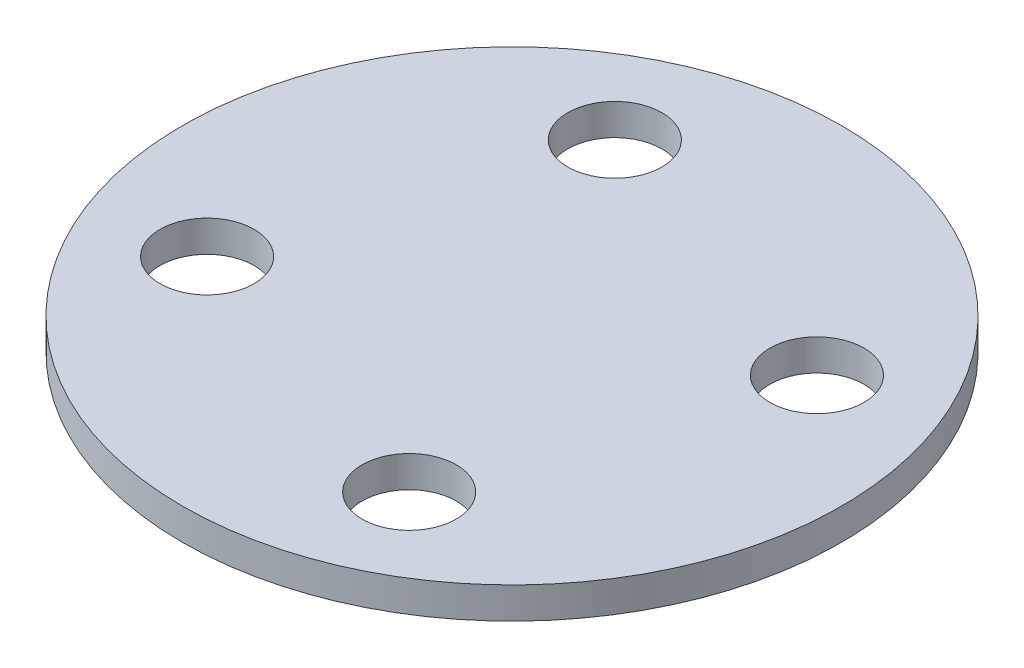
ISO-10303-21;
HEADER;
FILE_DESCRIPTION(('STEP AP214'),'2;1');
FILE_NAME('part.step','',(''),(''),'','','');
FILE_SCHEMA(('AUTOMOTIVE_DESIGN { 1 0 10303 214 1 1 1 1 }'));
ENDSEC;
DATA;
#1=APPLICATION_CONTEXT('core data for automotive mechanical design processes');
#2=APPLICATION_PROTOCOL_DEFINITION('international standard','automotive_design',2000,#1);
#3=PRODUCT_CONTEXT('',#1,'mechanical');
#4=PRODUCT('Part','Part','',(#3));
#5=PRODUCT_RELATED_PRODUCT_CATEGORY('part','',(#4));
#6=PRODUCT_DEFINITION_FORMATION('','',#4);
#7=PRODUCT_DEFINITION_CONTEXT('part definition',#1,'design');
#8=PRODUCT_DEFINITION('design','',#6,#7);
#9=PRODUCT_DEFINITION_SHAPE('','',#8);
#10=(LENGTH_UNIT() NAMED_UNIT(*) SI_UNIT(.MILLI.,.METRE.));
#11=(NAMED_UNIT(*) PLANE_ANGLE_UNIT() SI_UNIT($,.RADIAN.));
#12=(NAMED_UNIT(*) SI_UNIT($,.STERADIAN.) SOLID_ANGLE_UNIT());
#13=UNCERTAINTY_MEASURE_WITH_UNIT(LENGTH_MEASURE(1.E-05),#10,'distance_accuracy_value','');
#14=(GEOMETRIC_REPRESENTATION_CONTEXT(3) GLOBAL_UNCERTAINTY_ASSIGNED_CONTEXT((#13)) GLOBAL_UNIT_ASSIGNED_CONTEXT((#10,
#11,#12)) REPRESENTATION_CONTEXT('',''));
#15=CARTESIAN_POINT('',(0.,0.,0.));
#16=DIRECTION('',(0.,0.,1.));
#17=DIRECTION('',(1.,0.,0.));
#18=AXIS2_PLACEMENT_3D('',#15,#16,#17);
#19=CARTESIAN_POINT('',(0.,1.,0.));
#20=DIRECTION('',(0.,-1.,0.));
#21=DIRECTION('',(0.,0.,-1.));
#22=AXIS2_PLACEMENT_3D('',#19,#20,#21);
#23=CYLINDRICAL_SURFACE('',#22,10.5);
#24=CARTESIAN_POINT('',(0.,1.,0.));
#25=DIRECTION('',(0.,1.,0.));
#26=DIRECTION('',(0.,0.,1.));
#27=AXIS2_PLACEMENT_3D('',#24,#25,#26);
#28=CIRCLE('',#27,10.5);
#29=CARTESIAN_POINT('',(0.,1.,10.5));
#30=VERTEX_POINT('',#29);
#31=EDGE_CURVE('E10',#30,#30,#28,.T.);
#32=ORIENTED_EDGE('',*,*,#31,.F.);
#33=EDGE_LOOP('',(#32));
#34=FACE_BOUND('',#33,.T.);
#35=CARTESIAN_POINT('',(0.,0.,0.));
#36=DIRECTION('',(0.,1.,0.));
#37=DIRECTION('',(0.,0.,1.));
#38=AXIS2_PLACEMENT_3D('',#35,#36,#37);
#39=CIRCLE('',#38,10.5);
#40=CARTESIAN_POINT('',(0.,0.,10.5));
#41=VERTEX_POINT('',#40);
#42=EDGE_CURVE('E34',#41,#41,#39,.T.);
#43=ORIENTED_EDGE('',*,*,#42,.T.);
#44=EDGE_LOOP('',(#43));
#45=FACE_BOUND('',#44,.T.);
#46=ADVANCED_FACE('F31',(#34,#45),#23,.T.);
#47=CARTESIAN_POINT('',(0.,1.,0.));
#48=DIRECTION('',(0.,1.,0.));
#49=DIRECTION('',(0.,0.,1.));
#50=AXIS2_PLACEMENT_3D('',#47,#48,#49);
#51=PLANE('',#50);
#52=CARTESIAN_POINT('',(-6.49587656361794,1.,3.21964092255093));
#53=DIRECTION('',(0.,-1.,0.));
#54=DIRECTION('',(0.,0.,-1.));
#55=AXIS2_PLACEMENT_3D('',#52,#53,#54);
#56=CIRCLE('',#55,1.50000000000522);
#57=CARTESIAN_POINT('',(-6.49587656361794,1.,1.71964092254571));
#58=VERTEX_POINT('',#57);
#59=EDGE_CURVE('E58',#58,#58,#56,.T.);
#60=ORIENTED_EDGE('',*,*,#59,.T.);
#61=EDGE_LOOP('',(#60));
#62=FACE_BOUND('',#61,.T.);
#63=CARTESIAN_POINT('',(3.2196409225571,1.,6.49587656362313));
#64=DIRECTION('',(0.,-1.,0.));
#65=DIRECTION('',(0.,0.,-1.));
#66=AXIS2_PLACEMENT_3D('',#63,#64,#65);
#67=CIRCLE('',#66,1.50000000000259);
#68=CARTESIAN_POINT('',(3.2196409225571,1.,4.99587656362054));
#69=VERTEX_POINT('',#68);
#70=EDGE_CURVE('E52',#69,#69,#67,.T.);
#71=ORIENTED_EDGE('',*,*,#70,.T.);
#72=EDGE_LOOP('',(#71));
#73=FACE_BOUND('',#72,.T.);
#74=CARTESIAN_POINT('',(-3.21964092254574,1.,-6.49587656362411));
#75=DIRECTION('',(0.,-1.,0.));
#76=DIRECTION('',(0.,0.,-1.));
#77=AXIS2_PLACEMENT_3D('',#74,#75,#76);
#78=CIRCLE('',#77,1.49999999999743);
#79=CARTESIAN_POINT('',(-3.21964092254574,1.,-7.99587656362154));
#80=VERTEX_POINT('',#79);
#81=EDGE_CURVE('E46',#80,#80,#78,.T.);
#82=ORIENTED_EDGE('',*,*,#81,.T.);
#83=EDGE_LOOP('',(#82));
#84=FACE_BOUND('',#83,.T.);
#85=CARTESIAN_POINT('',(6.49587656362965,1.,-3.21964092255211));
#86=DIRECTION('',(0.,-1.,0.));
#87=DIRECTION('',(0.,0.,-1.));
#88=AXIS2_PLACEMENT_3D('',#85,#86,#87);
#89=CIRCLE('',#88,1.49999999999448);
#90=CARTESIAN_POINT('',(6.49587656362965,1.,-4.71964092254659));
#91=VERTEX_POINT('',#90);
#92=EDGE_CURVE('E41',#91,#91,#89,.T.);
#93=ORIENTED_EDGE('',*,*,#92,.T.);
#94=EDGE_LOOP('',(#93));
#95=FACE_BOUND('',#94,.T.);
#96=ORIENTED_EDGE('',*,*,#31,.T.);
#97=EDGE_LOOP('',(#96));
#98=FACE_BOUND('',#97,.T.);
#99=ADVANCED_FACE('F67',(#62,#73,#84,#95,#98),#51,.T.);
#100=CARTESIAN_POINT('',(0.,0.,0.));
#101=DIRECTION('',(0.,1.,0.));
#102=DIRECTION('',(0.,0.,1.));
#103=AXIS2_PLACEMENT_3D('',#100,#101,#102);
#104=PLANE('',#103);
#105=CARTESIAN_POINT('',(-6.49587656361794,0.,3.21964092255093));
#106=DIRECTION('',(0.,-1.,0.));
#107=DIRECTION('',(0.,0.,-1.));
#108=AXIS2_PLACEMENT_3D('',#105,#106,#107);
#109=CIRCLE('',#108,1.50000000000522);
#110=CARTESIAN_POINT('',(-6.49587656361794,0.,1.71964092254571));
#111=VERTEX_POINT('',#110);
#112=EDGE_CURVE('E61',#111,#111,#109,.T.);
#113=ORIENTED_EDGE('',*,*,#112,.F.);
#114=EDGE_LOOP('',(#113));
#115=FACE_BOUND('',#114,.T.);
#116=CARTESIAN_POINT('',(3.2196409225571,0.,6.49587656362313));
#117=DIRECTION('',(0.,-1.,0.));
#118=DIRECTION('',(0.,0.,-1.));
#119=AXIS2_PLACEMENT_3D('',#116,#117,#118);
#120=CIRCLE('',#119,1.50000000000259);
#121=CARTESIAN_POINT('',(3.2196409225571,0.,4.99587656362054));
#122=VERTEX_POINT('',#121);
#123=EDGE_CURVE('E55',#122,#122,#120,.T.);
#124=ORIENTED_EDGE('',*,*,#123,.F.);
#125=EDGE_LOOP('',(#124));
#126=FACE_BOUND('',#125,.T.);
#127=CARTESIAN_POINT('',(-3.21964092254574,0.,-6.49587656362411));
#128=DIRECTION('',(0.,-1.,0.));
#129=DIRECTION('',(0.,0.,-1.));
#130=AXIS2_PLACEMENT_3D('',#127,#128,#129);
#131=CIRCLE('',#130,1.49999999999743);
#132=CARTESIAN_POINT('',(-3.21964092254574,0.,-7.99587656362154));
#133=VERTEX_POINT('',#132);
#134=EDGE_CURVE('E49',#133,#133,#131,.T.);
#135=ORIENTED_EDGE('',*,*,#134,.F.);
#136=EDGE_LOOP('',(#135));
#137=FACE_BOUND('',#136,.T.);
#138=CARTESIAN_POINT('',(6.49587656362965,0.,-3.21964092255211));
#139=DIRECTION('',(0.,-1.,0.));
#140=DIRECTION('',(0.,0.,-1.));
#141=AXIS2_PLACEMENT_3D('',#138,#139,#140);
#142=CIRCLE('',#141,1.49999999999448);
#143=CARTESIAN_POINT('',(6.49587656362965,0.,-4.71964092254659));
#144=VERTEX_POINT('',#143);
#145=EDGE_CURVE('E43',#144,#144,#142,.T.);
#146=ORIENTED_EDGE('',*,*,#145,.F.);
#147=EDGE_LOOP('',(#146));
#148=FACE_BOUND('',#147,.T.);
#149=ORIENTED_EDGE('',*,*,#42,.F.);
#150=EDGE_LOOP('',(#149));
#151=FACE_BOUND('',#150,.T.);
#152=ADVANCED_FACE('F77',(#115,#126,#137,#148,#151),#104,.F.);
#153=CARTESIAN_POINT('',(6.49587656362965,1.,-3.21964092255211));
#154=DIRECTION('',(0.,-1.,0.));
#155=DIRECTION('',(0.,0.,-1.));
#156=AXIS2_PLACEMENT_3D('',#153,#154,#155);
#157=CYLINDRICAL_SURFACE('',#156,1.49999999999448);
#158=ORIENTED_EDGE('',*,*,#92,.F.);
#159=EDGE_LOOP('',(#158));
#160=FACE_BOUND('',#159,.T.);
#161=ORIENTED_EDGE('',*,*,#145,.T.);
#162=EDGE_LOOP('',(#161));
#163=FACE_BOUND('',#162,.T.);
#164=ADVANCED_FACE('F80',(#160,#163),#157,.F.);
#165=CARTESIAN_POINT('',(-3.21964092254574,1.,-6.49587656362411));
#166=DIRECTION('',(0.,-1.,0.));
#167=DIRECTION('',(0.,0.,-1.));
#168=AXIS2_PLACEMENT_3D('',#165,#166,#167);
#169=CYLINDRICAL_SURFACE('',#168,1.49999999999743);
#170=ORIENTED_EDGE('',*,*,#81,.F.);
#171=EDGE_LOOP('',(#170));
#172=FACE_BOUND('',#171,.T.);
#173=ORIENTED_EDGE('',*,*,#134,.T.);
#174=EDGE_LOOP('',(#173));
#175=FACE_BOUND('',#174,.T.);
#176=ADVANCED_FACE('F100',(#172,#175),#169,.F.);
#177=CARTESIAN_POINT('',(3.2196409225571,1.,6.49587656362313));
#178=DIRECTION('',(0.,-1.,0.));
#179=DIRECTION('',(0.,0.,-1.));
#180=AXIS2_PLACEMENT_3D('',#177,#178,#179);
#181=CYLINDRICAL_SURFACE('',#180,1.50000000000259);
#182=ORIENTED_EDGE('',*,*,#70,.F.);
#183=EDGE_LOOP('',(#182));
#184=FACE_BOUND('',#183,.T.);
#185=ORIENTED_EDGE('',*,*,#123,.T.);
#186=EDGE_LOOP('',(#185));
#187=FACE_BOUND('',#186,.T.);
#188=ADVANCED_FACE('F73',(#184,#187),#181,.F.);
#189=CARTESIAN_POINT('',(-6.49587656361794,1.,3.21964092255093));
#190=DIRECTION('',(0.,-1.,0.));
#191=DIRECTION('',(0.,0.,-1.));
#192=AXIS2_PLACEMENT_3D('',#189,#190,#191);
#193=CYLINDRICAL_SURFACE('',#192,1.50000000000522);
#194=ORIENTED_EDGE('',*,*,#59,.F.);
#195=EDGE_LOOP('',(#194));
#196=FACE_BOUND('',#195,.T.);
#197=ORIENTED_EDGE('',*,*,#112,.T.);
#198=EDGE_LOOP('',(#197));
#199=FACE_BOUND('',#198,.T.);
#200=ADVANCED_FACE('F70',(#196,#199),#193,.F.);
#201=CLOSED_SHELL('',(#46,#99,#152,#164,#176,#188,#200));
#202=MANIFOLD_SOLID_BREP('B2',#201);
#203=ADVANCED_BREP_SHAPE_REPRESENTATION('',(#18,#202),#14);
#204=SHAPE_DEFINITION_REPRESENTATION(#9,#203);
ENDSEC;
END-ISO-10303-21;
